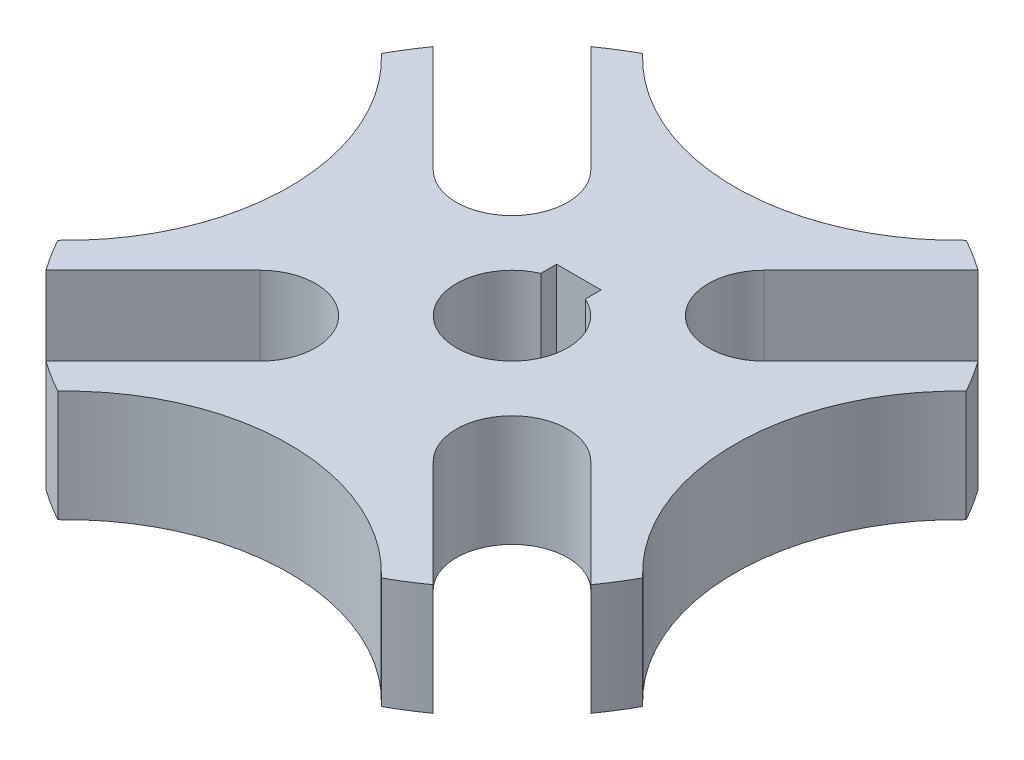
ISO-10303-21;
HEADER;
FILE_DESCRIPTION(('STEP AP214'),'2;1');
FILE_NAME('part.step','',(''),(''),'','','');
FILE_SCHEMA(('AUTOMOTIVE_DESIGN { 1 0 10303 214 1 1 1 1 }'));
ENDSEC;
DATA;
#1=APPLICATION_CONTEXT('core data for automotive mechanical design processes');
#2=APPLICATION_PROTOCOL_DEFINITION('international standard','automotive_design',2000,#1);
#3=PRODUCT_CONTEXT('',#1,'mechanical');
#4=PRODUCT('Part','Part','',(#3));
#5=PRODUCT_RELATED_PRODUCT_CATEGORY('part','',(#4));
#6=PRODUCT_DEFINITION_FORMATION('','',#4);
#7=PRODUCT_DEFINITION_CONTEXT('part definition',#1,'design');
#8=PRODUCT_DEFINITION('design','',#6,#7);
#9=PRODUCT_DEFINITION_SHAPE('','',#8);
#10=(LENGTH_UNIT() NAMED_UNIT(*) SI_UNIT(.MILLI.,.METRE.));
#11=(NAMED_UNIT(*) PLANE_ANGLE_UNIT() SI_UNIT($,.RADIAN.));
#12=(NAMED_UNIT(*) SI_UNIT($,.STERADIAN.) SOLID_ANGLE_UNIT());
#13=UNCERTAINTY_MEASURE_WITH_UNIT(LENGTH_MEASURE(1.E-05),#10,'distance_accuracy_value','');
#14=(GEOMETRIC_REPRESENTATION_CONTEXT(3) GLOBAL_UNCERTAINTY_ASSIGNED_CONTEXT((#13)) GLOBAL_UNIT_ASSIGNED_CONTEXT((#10,
#11,#12)) REPRESENTATION_CONTEXT('',''));
#15=CARTESIAN_POINT('',(0.,0.,0.));
#16=DIRECTION('',(0.,0.,1.));
#17=DIRECTION('',(1.,0.,0.));
#18=AXIS2_PLACEMENT_3D('',#15,#16,#17);
#19=CARTESIAN_POINT('',(0.,5.,0.));
#20=DIRECTION('',(0.,-1.,0.));
#21=DIRECTION('',(0.,0.,-1.));
#22=AXIS2_PLACEMENT_3D('',#19,#20,#21);
#23=CYLINDRICAL_SURFACE('',#22,15.);
#24=CARTESIAN_POINT('',(0.,5.,0.));
#25=DIRECTION('',(0.,1.,0.));
#26=DIRECTION('',(0.,0.,1.));
#27=AXIS2_PLACEMENT_3D('',#24,#25,#26);
#28=CIRCLE('',#27,15.);
#29=CARTESIAN_POINT('',(-8.69048337870963,5.,12.2260172846423));
#30=VERTEX_POINT('',#29);
#31=CARTESIAN_POINT('',(-7.26184377413899,5.,13.1249999999999));
#32=VERTEX_POINT('',#31);
#33=EDGE_CURVE('E362',#30,#32,#28,.T.);
#34=ORIENTED_EDGE('',*,*,#33,.F.);
#35=DIRECTION('',(0.,-1.,0.));
#36=VECTOR('',#35,1.);
#37=CARTESIAN_POINT('',(-8.69048337870963,5.,12.2260172846423));
#38=LINE('',#37,#36);
#39=CARTESIAN_POINT('',(-8.69048337870963,0.,12.2260172846423));
#40=VERTEX_POINT('',#39);
#41=EDGE_CURVE('E305',#30,#40,#38,.T.);
#42=ORIENTED_EDGE('',*,*,#41,.T.);
#43=CARTESIAN_POINT('',(0.,0.,0.));
#44=DIRECTION('',(0.,1.,0.));
#45=DIRECTION('',(0.,0.,1.));
#46=AXIS2_PLACEMENT_3D('',#43,#44,#45);
#47=CIRCLE('',#46,15.);
#48=CARTESIAN_POINT('',(-7.261843774139,0.,13.125));
#49=VERTEX_POINT('',#48);
#50=EDGE_CURVE('E354',#40,#49,#47,.T.);
#51=ORIENTED_EDGE('',*,*,#50,.T.);
#52=DIRECTION('',(0.,1.,0.));
#53=VECTOR('',#52,1.);
#54=CARTESIAN_POINT('',(-7.26184377413899,0.,13.125));
#55=LINE('',#54,#53);
#56=EDGE_CURVE('E397',#49,#32,#55,.T.);
#57=ORIENTED_EDGE('',*,*,#56,.T.);
#58=EDGE_LOOP('',(#34,#42,#51,#57));
#59=FACE_BOUND('',#58,.T.);
#60=ADVANCED_FACE('F39',(#59),#23,.T.);
#61=CARTESIAN_POINT('',(12.2260172846423,5.,8.69048337870959));
#62=VERTEX_POINT('',#61);
#63=CARTESIAN_POINT('',(13.125,5.,7.26184377413895));
#64=VERTEX_POINT('',#63);
#65=EDGE_CURVE('E361',#62,#64,#28,.T.);
#66=ORIENTED_EDGE('',*,*,#65,.F.);
#67=DIRECTION('',(0.,-1.,0.));
#68=VECTOR('',#67,1.);
#69=CARTESIAN_POINT('',(12.2260172846423,5.,8.69048337870959));
#70=LINE('',#69,#68);
#71=CARTESIAN_POINT('',(12.2260172846423,0.,8.69048337870959));
#72=VERTEX_POINT('',#71);
#73=EDGE_CURVE('E301',#62,#72,#70,.T.);
#74=ORIENTED_EDGE('',*,*,#73,.T.);
#75=CARTESIAN_POINT('',(13.125,0.,7.26184377413895));
#76=VERTEX_POINT('',#75);
#77=EDGE_CURVE('E367',#72,#76,#47,.T.);
#78=ORIENTED_EDGE('',*,*,#77,.T.);
#79=DIRECTION('',(0.,1.,0.));
#80=VECTOR('',#79,1.);
#81=CARTESIAN_POINT('',(13.125,0.,7.26184377413895));
#82=LINE('',#81,#80);
#83=EDGE_CURVE('E391',#76,#64,#82,.T.);
#84=ORIENTED_EDGE('',*,*,#83,.T.);
#85=EDGE_LOOP('',(#66,#74,#78,#84));
#86=FACE_BOUND('',#85,.T.);
#87=ADVANCED_FACE('F457',(#86),#23,.T.);
#88=CARTESIAN_POINT('',(-12.2260172846424,5.,-8.6904833787095));
#89=VERTEX_POINT('',#88);
#90=CARTESIAN_POINT('',(-13.1249999999999,5.,-7.26184377413904));
#91=VERTEX_POINT('',#90);
#92=EDGE_CURVE('E467',#89,#91,#28,.T.);
#93=ORIENTED_EDGE('',*,*,#92,.F.);
#94=DIRECTION('',(0.,-1.,0.));
#95=VECTOR('',#94,1.);
#96=CARTESIAN_POINT('',(-12.2260172846424,5.,-8.6904833787095));
#97=LINE('',#96,#95);
#98=CARTESIAN_POINT('',(-12.2260172846424,0.,-8.6904833787095));
#99=VERTEX_POINT('',#98);
#100=EDGE_CURVE('E295',#89,#99,#97,.T.);
#101=ORIENTED_EDGE('',*,*,#100,.T.);
#102=CARTESIAN_POINT('',(-13.1249999999999,0.,-7.26184377413904));
#103=VERTEX_POINT('',#102);
#104=EDGE_CURVE('E368',#99,#103,#47,.T.);
#105=ORIENTED_EDGE('',*,*,#104,.T.);
#106=DIRECTION('',(0.,1.,0.));
#107=VECTOR('',#106,1.);
#108=CARTESIAN_POINT('',(-13.1249999999999,0.,-7.26184377413904));
#109=LINE('',#108,#107);
#110=EDGE_CURVE('E385',#103,#91,#109,.T.);
#111=ORIENTED_EDGE('',*,*,#110,.T.);
#112=EDGE_LOOP('',(#93,#101,#105,#111));
#113=FACE_BOUND('',#112,.T.);
#114=ADVANCED_FACE('F505',(#113),#23,.T.);
#115=CARTESIAN_POINT('',(8.69048337870955,5.,-12.2260172846423));
#116=VERTEX_POINT('',#115);
#117=CARTESIAN_POINT('',(7.2618437741389,5.,-13.125));
#118=VERTEX_POINT('',#117);
#119=EDGE_CURVE('E466',#116,#118,#28,.T.);
#120=ORIENTED_EDGE('',*,*,#119,.F.);
#121=DIRECTION('',(0.,-1.,0.));
#122=VECTOR('',#121,1.);
#123=CARTESIAN_POINT('',(8.69048337870954,5.,-12.2260172846423));
#124=LINE('',#123,#122);
#125=CARTESIAN_POINT('',(8.69048337870954,0.,-12.2260172846423));
#126=VERTEX_POINT('',#125);
#127=EDGE_CURVE('E242',#116,#126,#124,.T.);
#128=ORIENTED_EDGE('',*,*,#127,.T.);
#129=CARTESIAN_POINT('',(7.26184377413891,0.,-13.125));
#130=VERTEX_POINT('',#129);
#131=EDGE_CURVE('E447',#126,#130,#47,.T.);
#132=ORIENTED_EDGE('',*,*,#131,.T.);
#133=DIRECTION('',(0.,1.,0.));
#134=VECTOR('',#133,1.);
#135=CARTESIAN_POINT('',(7.2618437741389,0.,-13.125));
#136=LINE('',#135,#134);
#137=EDGE_CURVE('E379',#130,#118,#136,.T.);
#138=ORIENTED_EDGE('',*,*,#137,.T.);
#139=EDGE_LOOP('',(#120,#128,#132,#138));
#140=FACE_BOUND('',#139,.T.);
#141=ADVANCED_FACE('F536',(#140),#23,.T.);
#142=CARTESIAN_POINT('',(-13.1250000000001,0.,7.26184377413877));
#143=VERTEX_POINT('',#142);
#144=CARTESIAN_POINT('',(-12.2260172846424,0.,8.69048337870952));
#145=VERTEX_POINT('',#144);
#146=EDGE_CURVE('E445',#143,#145,#47,.T.);
#147=ORIENTED_EDGE('',*,*,#146,.T.);
#148=DIRECTION('',(0.,-1.,0.));
#149=VECTOR('',#148,1.);
#150=CARTESIAN_POINT('',(-12.2260172846424,5.,8.69048337870952));
#151=LINE('',#150,#149);
#152=CARTESIAN_POINT('',(-12.2260172846424,5.,8.69048337870952));
#153=VERTEX_POINT('',#152);
#154=EDGE_CURVE('E62',#145,#153,#151,.F.);
#155=ORIENTED_EDGE('',*,*,#154,.T.);
#156=CARTESIAN_POINT('',(-13.1250000000001,5.,7.26184377413878));
#157=VERTEX_POINT('',#156);
#158=EDGE_CURVE('E441',#157,#153,#28,.T.);
#159=ORIENTED_EDGE('',*,*,#158,.F.);
#160=DIRECTION('',(0.,1.,0.));
#161=VECTOR('',#160,1.);
#162=CARTESIAN_POINT('',(-13.1250000000001,0.,7.26184377413878));
#163=LINE('',#162,#161);
#164=EDGE_CURVE('E382',#157,#143,#163,.F.);
#165=ORIENTED_EDGE('',*,*,#164,.T.);
#166=EDGE_LOOP('',(#147,#155,#159,#165));
#167=FACE_BOUND('',#166,.T.);
#168=ADVANCED_FACE('F444',(#167),#23,.T.);
#169=CARTESIAN_POINT('',(7.26184377413882,0.,13.125));
#170=VERTEX_POINT('',#169);
#171=CARTESIAN_POINT('',(8.69048337870957,0.,12.2260172846423));
#172=VERTEX_POINT('',#171);
#173=EDGE_CURVE('E364',#170,#172,#47,.T.);
#174=ORIENTED_EDGE('',*,*,#173,.T.);
#175=DIRECTION('',(0.,-1.,0.));
#176=VECTOR('',#175,1.);
#177=CARTESIAN_POINT('',(8.69048337870957,5.,12.2260172846423));
#178=LINE('',#177,#176);
#179=CARTESIAN_POINT('',(8.69048337870957,5.,12.2260172846423));
#180=VERTEX_POINT('',#179);
#181=EDGE_CURVE('E298',#172,#180,#178,.F.);
#182=ORIENTED_EDGE('',*,*,#181,.T.);
#183=CARTESIAN_POINT('',(7.26184377413882,5.,13.125));
#184=VERTEX_POINT('',#183);
#185=EDGE_CURVE('E357',#184,#180,#28,.T.);
#186=ORIENTED_EDGE('',*,*,#185,.F.);
#187=DIRECTION('',(0.,1.,0.));
#188=VECTOR('',#187,1.);
#189=CARTESIAN_POINT('',(7.26184377413882,0.,13.125));
#190=LINE('',#189,#188);
#191=EDGE_CURVE('E394',#184,#170,#190,.F.);
#192=ORIENTED_EDGE('',*,*,#191,.T.);
#193=EDGE_LOOP('',(#174,#182,#186,#192));
#194=FACE_BOUND('',#193,.T.);
#195=ADVANCED_FACE('F480',(#194),#23,.T.);
#196=CARTESIAN_POINT('',(-7.26184377413891,0.,-13.125));
#197=VERTEX_POINT('',#196);
#198=CARTESIAN_POINT('',(-8.69048337870965,0.,-12.2260172846423));
#199=VERTEX_POINT('',#198);
#200=EDGE_CURVE('E446',#197,#199,#47,.T.);
#201=ORIENTED_EDGE('',*,*,#200,.T.);
#202=DIRECTION('',(0.,-1.,0.));
#203=VECTOR('',#202,1.);
#204=CARTESIAN_POINT('',(-8.69048337870965,5.,-12.2260172846423));
#205=LINE('',#204,#203);
#206=CARTESIAN_POINT('',(-8.69048337870965,5.,-12.2260172846423));
#207=VERTEX_POINT('',#206);
#208=EDGE_CURVE('E54',#199,#207,#205,.F.);
#209=ORIENTED_EDGE('',*,*,#208,.T.);
#210=CARTESIAN_POINT('',(-7.26184377413891,5.,-13.125));
#211=VERTEX_POINT('',#210);
#212=EDGE_CURVE('E468',#211,#207,#28,.T.);
#213=ORIENTED_EDGE('',*,*,#212,.F.);
#214=DIRECTION('',(0.,1.,0.));
#215=VECTOR('',#214,1.);
#216=CARTESIAN_POINT('',(-7.26184377413891,0.,-13.125));
#217=LINE('',#216,#215);
#218=EDGE_CURVE('E376',#211,#197,#217,.F.);
#219=ORIENTED_EDGE('',*,*,#218,.T.);
#220=EDGE_LOOP('',(#201,#209,#213,#219));
#221=FACE_BOUND('',#220,.T.);
#222=ADVANCED_FACE('F508',(#221),#23,.T.);
#223=CARTESIAN_POINT('',(0.,5.,0.));
#224=DIRECTION('',(0.,1.,0.));
#225=DIRECTION('',(0.,0.,1.));
#226=AXIS2_PLACEMENT_3D('',#223,#224,#225);
#227=PLANE('',#226);
#228=DIRECTION('',(0.707106781186554,0.,-0.707106781186541));
#229=VECTOR('',#228,1.);
#230=CARTESIAN_POINT('',(-9.10439808349534,5.,12.639931989428));
#231=LINE('',#230,#229);
#232=CARTESIAN_POINT('',(-3.88908729652603,5.,7.42462120245877));
#233=VERTEX_POINT('',#232);
#234=EDGE_CURVE('E272',#30,#233,#231,.T.);
#235=ORIENTED_EDGE('',*,*,#234,.F.);
#236=ORIENTED_EDGE('',*,*,#33,.T.);
#237=CARTESIAN_POINT('',(-1.32923696158415E-13,5.,20.));
#238=DIRECTION('',(0.,1.,0.));
#239=DIRECTION('',(0.,0.,1.));
#240=AXIS2_PLACEMENT_3D('',#237,#238,#239);
#241=CIRCLE('',#240,10.);
#242=EDGE_CURVE('E311',#184,#32,#241,.T.);
#243=ORIENTED_EDGE('',*,*,#242,.F.);
#244=ORIENTED_EDGE('',*,*,#185,.T.);
#245=DIRECTION('',(0.707106781186543,0.,0.707106781186552));
#246=VECTOR('',#245,1.);
#247=CARTESIAN_POINT('',(9.10439808349525,5.,12.639931989428));
#248=LINE('',#247,#246);
#249=CARTESIAN_POINT('',(3.88908729652602,5.,7.42462120245871));
#250=VERTEX_POINT('',#249);
#251=EDGE_CURVE('E266',#250,#180,#248,.T.);
#252=ORIENTED_EDGE('',*,*,#251,.F.);
#253=CARTESIAN_POINT('',(5.65685424949231,5.,5.65685424949245));
#254=DIRECTION('',(0.,1.,0.));
#255=DIRECTION('',(0.,0.,1.));
#256=AXIS2_PLACEMENT_3D('',#253,#254,#255);
#257=CIRCLE('',#256,2.5);
#258=CARTESIAN_POINT('',(7.42462120245878,5.,3.889087296526));
#259=VERTEX_POINT('',#258);
#260=EDGE_CURVE('E236',#259,#250,#257,.T.);
#261=ORIENTED_EDGE('',*,*,#260,.F.);
#262=DIRECTION('',(-0.707106781186543,0.,-0.707106781186552));
#263=VECTOR('',#262,1.);
#264=CARTESIAN_POINT('',(12.639931989428,5.,9.1043980834953));
#265=LINE('',#264,#263);
#266=EDGE_CURVE('E260',#62,#259,#265,.T.);
#267=ORIENTED_EDGE('',*,*,#266,.F.);
#268=ORIENTED_EDGE('',*,*,#65,.T.);
#269=CARTESIAN_POINT('',(20.,5.,0.));
#270=DIRECTION('',(0.,1.,0.));
#271=DIRECTION('',(0.,0.,1.));
#272=AXIS2_PLACEMENT_3D('',#269,#270,#271);
#273=CIRCLE('',#272,10.);
#274=CARTESIAN_POINT('',(13.125,5.,-7.26184377413886));
#275=VERTEX_POINT('',#274);
#276=EDGE_CURVE('E314',#275,#64,#273,.T.);
#277=ORIENTED_EDGE('',*,*,#276,.F.);
#278=CARTESIAN_POINT('',(12.2260172846423,5.,-8.69048337870961));
#279=VERTEX_POINT('',#278);
#280=EDGE_CURVE('E363',#275,#279,#28,.T.);
#281=ORIENTED_EDGE('',*,*,#280,.T.);
#282=DIRECTION('',(0.70710678118655,0.,-0.707106781186546));
#283=VECTOR('',#282,1.);
#284=CARTESIAN_POINT('',(12.639931989428,5.,-9.1043980834953));
#285=LINE('',#284,#283);
#286=CARTESIAN_POINT('',(7.4246212024587,5.,-3.88908729652605));
#287=VERTEX_POINT('',#286);
#288=EDGE_CURVE('E245',#287,#279,#285,.T.);
#289=ORIENTED_EDGE('',*,*,#288,.F.);
#290=CARTESIAN_POINT('',(5.65685424949242,5.,-5.65685424949233));
#291=DIRECTION('',(0.,1.,0.));
#292=DIRECTION('',(0.,0.,1.));
#293=AXIS2_PLACEMENT_3D('',#290,#291,#292);
#294=CIRCLE('',#293,2.5);
#295=CARTESIAN_POINT('',(3.88908729652598,5.,-7.42462120245879));
#296=VERTEX_POINT('',#295);
#297=EDGE_CURVE('E229',#296,#287,#294,.T.);
#298=ORIENTED_EDGE('',*,*,#297,.F.);
#299=DIRECTION('',(-0.70710678118655,0.,0.707106781186546));
#300=VECTOR('',#299,1.);
#301=CARTESIAN_POINT('',(9.10439808349525,5.,-12.639931989428));
#302=LINE('',#301,#300);
#303=EDGE_CURVE('E239',#116,#296,#302,.T.);
#304=ORIENTED_EDGE('',*,*,#303,.F.);
#305=ORIENTED_EDGE('',*,*,#119,.T.);
#306=CARTESIAN_POINT('',(0.,5.,-20.));
#307=DIRECTION('',(0.,1.,0.));
#308=DIRECTION('',(0.,0.,1.));
#309=AXIS2_PLACEMENT_3D('',#306,#307,#308);
#310=CIRCLE('',#309,10.);
#311=EDGE_CURVE('E317',#211,#118,#310,.T.);
#312=ORIENTED_EDGE('',*,*,#311,.F.);
#313=ORIENTED_EDGE('',*,*,#212,.T.);
#314=DIRECTION('',(-0.707106781186548,0.,-0.707106781186547));
#315=VECTOR('',#314,1.);
#316=CARTESIAN_POINT('',(-9.10439808349534,5.,-12.6399319894279));
#317=LINE('',#316,#315);
#318=CARTESIAN_POINT('',(-3.88908729652607,5.,-7.42462120245869));
#319=VERTEX_POINT('',#318);
#320=EDGE_CURVE('E254',#319,#207,#317,.T.);
#321=ORIENTED_EDGE('',*,*,#320,.F.);
#322=CARTESIAN_POINT('',(-5.65685424949235,5.,-5.65685424949241));
#323=DIRECTION('',(0.,1.,0.));
#324=DIRECTION('',(0.,0.,1.));
#325=AXIS2_PLACEMENT_3D('',#322,#323,#324);
#326=CIRCLE('',#325,2.5);
#327=CARTESIAN_POINT('',(-7.42462120245881,5.,-3.88908729652595));
#328=VERTEX_POINT('',#327);
#329=EDGE_CURVE('E251',#328,#319,#326,.T.);
#330=ORIENTED_EDGE('',*,*,#329,.F.);
#331=DIRECTION('',(0.707106781186548,0.,0.707106781186547));
#332=VECTOR('',#331,1.);
#333=CARTESIAN_POINT('',(-12.6399319894281,5.,-9.10439808349521));
#334=LINE('',#333,#332);
#335=EDGE_CURVE('E282',#89,#328,#334,.T.);
#336=ORIENTED_EDGE('',*,*,#335,.F.);
#337=ORIENTED_EDGE('',*,*,#92,.T.);
#338=CARTESIAN_POINT('',(-20.,5.,-2.02753322935278E-13));
#339=DIRECTION('',(0.,1.,0.));
#340=DIRECTION('',(0.,0.,1.));
#341=AXIS2_PLACEMENT_3D('',#338,#339,#340);
#342=CIRCLE('',#341,10.);
#343=EDGE_CURVE('E308',#157,#91,#342,.T.);
#344=ORIENTED_EDGE('',*,*,#343,.F.);
#345=ORIENTED_EDGE('',*,*,#158,.T.);
#346=DIRECTION('',(-0.707106781186555,0.,0.707106781186541));
#347=VECTOR('',#346,1.);
#348=CARTESIAN_POINT('',(-12.639931989428,5.,9.10439808349521));
#349=LINE('',#348,#347);
#350=CARTESIAN_POINT('',(-7.42462120245873,5.,3.889087296526));
#351=VERTEX_POINT('',#350);
#352=EDGE_CURVE('E277',#351,#153,#349,.T.);
#353=ORIENTED_EDGE('',*,*,#352,.F.);
#354=CARTESIAN_POINT('',(-5.65685424949246,5.,5.6568542494923));
#355=DIRECTION('',(0.,1.,0.));
#356=DIRECTION('',(0.,0.,1.));
#357=AXIS2_PLACEMENT_3D('',#354,#355,#356);
#358=CIRCLE('',#357,2.5);
#359=EDGE_CURVE('E263',#233,#351,#358,.T.);
#360=ORIENTED_EDGE('',*,*,#359,.F.);
#361=EDGE_LOOP('',(#235,#236,#243,#244,#252,#261,#267,#268,#277,#281,#289,#298,#304,#305,#312,
#313,#321,#330,#336,#337,#344,#345,#353,#360));
#362=FACE_BOUND('',#361,.T.);
#363=DIRECTION('',(0.,0.,-1.));
#364=VECTOR('',#363,1.);
#365=CARTESIAN_POINT('',(1.,5.,-3.));
#366=LINE('',#365,#364);
#367=CARTESIAN_POINT('',(1.,5.,-2.29128784747792));
#368=VERTEX_POINT('',#367);
#369=CARTESIAN_POINT('',(1.,5.,-3.));
#370=VERTEX_POINT('',#369);
#371=EDGE_CURVE('E332',#368,#370,#366,.T.);
#372=ORIENTED_EDGE('',*,*,#371,.F.);
#373=CARTESIAN_POINT('',(0.,5.,0.));
#374=DIRECTION('',(0.,1.,0.));
#375=DIRECTION('',(0.,0.,1.));
#376=AXIS2_PLACEMENT_3D('',#373,#374,#375);
#377=CIRCLE('',#376,2.5);
#378=CARTESIAN_POINT('',(-1.,5.,-2.29128784747792));
#379=VERTEX_POINT('',#378);
#380=EDGE_CURVE('E351',#379,#368,#377,.T.);
#381=ORIENTED_EDGE('',*,*,#380,.F.);
#382=DIRECTION('',(0.,0.,1.));
#383=VECTOR('',#382,1.);
#384=CARTESIAN_POINT('',(-1.,5.,-3.));
#385=LINE('',#384,#383);
#386=CARTESIAN_POINT('',(-1.,5.,-3.));
#387=VERTEX_POINT('',#386);
#388=EDGE_CURVE('E338',#387,#379,#385,.T.);
#389=ORIENTED_EDGE('',*,*,#388,.F.);
#390=DIRECTION('',(-1.,0.,0.));
#391=VECTOR('',#390,1.);
#392=CARTESIAN_POINT('',(-1.,5.,-3.));
#393=LINE('',#392,#391);
#394=EDGE_CURVE('E335',#370,#387,#393,.T.);
#395=ORIENTED_EDGE('',*,*,#394,.F.);
#396=EDGE_LOOP('',(#372,#381,#389,#395));
#397=FACE_BOUND('',#396,.T.);
#398=ADVANCED_FACE('F248',(#362,#397),#227,.T.);
#399=CARTESIAN_POINT('',(0.,0.,0.));
#400=DIRECTION('',(0.,1.,0.));
#401=DIRECTION('',(0.,0.,1.));
#402=AXIS2_PLACEMENT_3D('',#399,#400,#401);
#403=PLANE('',#402);
#404=CARTESIAN_POINT('',(0.,0.,0.));
#405=DIRECTION('',(0.,1.,0.));
#406=DIRECTION('',(0.,0.,1.));
#407=AXIS2_PLACEMENT_3D('',#404,#405,#406);
#408=CIRCLE('',#407,2.5);
#409=CARTESIAN_POINT('',(-1.,0.,-2.29128784747792));
#410=VERTEX_POINT('',#409);
#411=CARTESIAN_POINT('',(1.,0.,-2.29128784747792));
#412=VERTEX_POINT('',#411);
#413=EDGE_CURVE('E350',#410,#412,#408,.T.);
#414=ORIENTED_EDGE('',*,*,#413,.T.);
#415=DIRECTION('',(0.,0.,-1.));
#416=VECTOR('',#415,1.);
#417=CARTESIAN_POINT('',(1.,0.,0.));
#418=LINE('',#417,#416);
#419=CARTESIAN_POINT('',(1.,0.,-3.));
#420=VERTEX_POINT('',#419);
#421=EDGE_CURVE('E347',#412,#420,#418,.T.);
#422=ORIENTED_EDGE('',*,*,#421,.T.);
#423=DIRECTION('',(-1.,0.,0.));
#424=VECTOR('',#423,1.);
#425=CARTESIAN_POINT('',(0.,0.,-3.));
#426=LINE('',#425,#424);
#427=CARTESIAN_POINT('',(-1.,0.,-3.));
#428=VERTEX_POINT('',#427);
#429=EDGE_CURVE('E373',#420,#428,#426,.T.);
#430=ORIENTED_EDGE('',*,*,#429,.T.);
#431=DIRECTION('',(0.,0.,1.));
#432=VECTOR('',#431,1.);
#433=CARTESIAN_POINT('',(-1.,0.,0.));
#434=LINE('',#433,#432);
#435=EDGE_CURVE('E343',#428,#410,#434,.T.);
#436=ORIENTED_EDGE('',*,*,#435,.T.);
#437=EDGE_LOOP('',(#414,#422,#430,#436));
#438=FACE_BOUND('',#437,.T.);
#439=ORIENTED_EDGE('',*,*,#50,.F.);
#440=DIRECTION('',(0.707106781186554,0.,-0.707106781186541));
#441=VECTOR('',#440,1.);
#442=CARTESIAN_POINT('',(1.76776695296641,0.,1.76776695296644));
#443=LINE('',#442,#441);
#444=CARTESIAN_POINT('',(-3.88908729652603,0.,7.42462120245877));
#445=VERTEX_POINT('',#444);
#446=EDGE_CURVE('E11',#40,#445,#443,.T.);
#447=ORIENTED_EDGE('',*,*,#446,.T.);
#448=CARTESIAN_POINT('',(-5.65685424949246,0.,5.6568542494923));
#449=DIRECTION('',(0.,1.,0.));
#450=DIRECTION('',(0.,0.,1.));
#451=AXIS2_PLACEMENT_3D('',#448,#449,#450);
#452=CIRCLE('',#451,2.5);
#453=CARTESIAN_POINT('',(-7.42462120245873,0.,3.889087296526));
#454=VERTEX_POINT('',#453);
#455=EDGE_CURVE('E47',#445,#454,#452,.T.);
#456=ORIENTED_EDGE('',*,*,#455,.T.);
#457=DIRECTION('',(-0.707106781186555,0.,0.707106781186541));
#458=VECTOR('',#457,1.);
#459=CARTESIAN_POINT('',(-1.76776695296629,0.,-1.76776695296633));
#460=LINE('',#459,#458);
#461=EDGE_CURVE('E422',#454,#145,#460,.T.);
#462=ORIENTED_EDGE('',*,*,#461,.T.);
#463=ORIENTED_EDGE('',*,*,#146,.F.);
#464=CARTESIAN_POINT('',(-20.,0.,-2.02753322935278E-13));
#465=DIRECTION('',(0.,1.,0.));
#466=DIRECTION('',(0.,0.,1.));
#467=AXIS2_PLACEMENT_3D('',#464,#465,#466);
#468=CIRCLE('',#467,10.);
#469=EDGE_CURVE('E323',#143,#103,#468,.T.);
#470=ORIENTED_EDGE('',*,*,#469,.T.);
#471=ORIENTED_EDGE('',*,*,#104,.F.);
#472=DIRECTION('',(0.707106781186548,0.,0.707106781186547));
#473=VECTOR('',#472,1.);
#474=CARTESIAN_POINT('',(-1.76776695296642,0.,1.76776695296643));
#475=LINE('',#474,#473);
#476=CARTESIAN_POINT('',(-7.42462120245881,0.,-3.88908729652595));
#477=VERTEX_POINT('',#476);
#478=EDGE_CURVE('E409',#99,#477,#475,.T.);
#479=ORIENTED_EDGE('',*,*,#478,.T.);
#480=CARTESIAN_POINT('',(-5.65685424949235,0.,-5.65685424949241));
#481=DIRECTION('',(0.,1.,0.));
#482=DIRECTION('',(0.,0.,1.));
#483=AXIS2_PLACEMENT_3D('',#480,#481,#482);
#484=CIRCLE('',#483,2.5);
#485=CARTESIAN_POINT('',(-3.88908729652607,0.,-7.42462120245869));
#486=VERTEX_POINT('',#485);
#487=EDGE_CURVE('E406',#477,#486,#484,.T.);
#488=ORIENTED_EDGE('',*,*,#487,.T.);
#489=DIRECTION('',(-0.707106781186548,0.,-0.707106781186547));
#490=VECTOR('',#489,1.);
#491=CARTESIAN_POINT('',(1.76776695296631,0.,-1.76776695296631));
#492=LINE('',#491,#490);
#493=EDGE_CURVE('E404',#486,#199,#492,.T.);
#494=ORIENTED_EDGE('',*,*,#493,.T.);
#495=ORIENTED_EDGE('',*,*,#200,.F.);
#496=CARTESIAN_POINT('',(0.,0.,-20.));
#497=DIRECTION('',(0.,1.,0.));
#498=DIRECTION('',(0.,0.,1.));
#499=AXIS2_PLACEMENT_3D('',#496,#497,#498);
#500=CIRCLE('',#499,10.);
#501=EDGE_CURVE('E320',#197,#130,#500,.T.);
#502=ORIENTED_EDGE('',*,*,#501,.T.);
#503=ORIENTED_EDGE('',*,*,#131,.F.);
#504=DIRECTION('',(-0.70710678118655,0.,0.707106781186546));
#505=VECTOR('',#504,1.);
#506=CARTESIAN_POINT('',(-1.76776695296642,0.,-1.76776695296643));
#507=LINE('',#506,#505);
#508=CARTESIAN_POINT('',(3.88908729652598,0.,-7.42462120245879));
#509=VERTEX_POINT('',#508);
#510=EDGE_CURVE('E292',#126,#509,#507,.T.);
#511=ORIENTED_EDGE('',*,*,#510,.T.);
#512=CARTESIAN_POINT('',(5.65685424949242,0.,-5.65685424949233));
#513=DIRECTION('',(0.,1.,0.));
#514=DIRECTION('',(0.,0.,1.));
#515=AXIS2_PLACEMENT_3D('',#512,#513,#514);
#516=CIRCLE('',#515,2.5);
#517=CARTESIAN_POINT('',(7.4246212024587,0.,-3.88908729652605));
#518=VERTEX_POINT('',#517);
#519=EDGE_CURVE('E232',#509,#518,#516,.T.);
#520=ORIENTED_EDGE('',*,*,#519,.T.);
#521=DIRECTION('',(0.70710678118655,0.,-0.707106781186546));
#522=VECTOR('',#521,1.);
#523=CARTESIAN_POINT('',(1.76776695296631,0.,1.76776695296632));
#524=LINE('',#523,#522);
#525=CARTESIAN_POINT('',(12.2260172846423,0.,-8.69048337870961));
#526=VERTEX_POINT('',#525);
#527=EDGE_CURVE('E288',#518,#526,#524,.T.);
#528=ORIENTED_EDGE('',*,*,#527,.T.);
#529=CARTESIAN_POINT('',(13.125,0.,-7.26184377413886));
#530=VERTEX_POINT('',#529);
#531=EDGE_CURVE('E369',#530,#526,#47,.T.);
#532=ORIENTED_EDGE('',*,*,#531,.F.);
#533=CARTESIAN_POINT('',(20.,0.,0.));
#534=DIRECTION('',(0.,1.,0.));
#535=DIRECTION('',(0.,0.,1.));
#536=AXIS2_PLACEMENT_3D('',#533,#534,#535);
#537=CIRCLE('',#536,10.);
#538=EDGE_CURVE('E326',#530,#76,#537,.T.);
#539=ORIENTED_EDGE('',*,*,#538,.T.);
#540=ORIENTED_EDGE('',*,*,#77,.F.);
#541=DIRECTION('',(-0.707106781186543,0.,-0.707106781186552));
#542=VECTOR('',#541,1.);
#543=CARTESIAN_POINT('',(1.76776695296644,0.,-1.76776695296641));
#544=LINE('',#543,#542);
#545=CARTESIAN_POINT('',(7.42462120245878,0.,3.889087296526));
#546=VERTEX_POINT('',#545);
#547=EDGE_CURVE('E419',#72,#546,#544,.T.);
#548=ORIENTED_EDGE('',*,*,#547,.T.);
#549=CARTESIAN_POINT('',(5.65685424949231,0.,5.65685424949245));
#550=DIRECTION('',(0.,1.,0.));
#551=DIRECTION('',(0.,0.,1.));
#552=AXIS2_PLACEMENT_3D('',#549,#550,#551);
#553=CIRCLE('',#552,2.5);
#554=CARTESIAN_POINT('',(3.88908729652602,0.,7.42462120245871));
#555=VERTEX_POINT('',#554);
#556=EDGE_CURVE('E416',#546,#555,#553,.T.);
#557=ORIENTED_EDGE('',*,*,#556,.T.);
#558=DIRECTION('',(0.707106781186543,0.,0.707106781186552));
#559=VECTOR('',#558,1.);
#560=CARTESIAN_POINT('',(-1.76776695296632,0.,1.7677669529663));
#561=LINE('',#560,#559);
#562=EDGE_CURVE('E413',#555,#172,#561,.T.);
#563=ORIENTED_EDGE('',*,*,#562,.T.);
#564=ORIENTED_EDGE('',*,*,#173,.F.);
#565=CARTESIAN_POINT('',(-1.32923696158415E-13,0.,20.));
#566=DIRECTION('',(0.,1.,0.));
#567=DIRECTION('',(0.,0.,1.));
#568=AXIS2_PLACEMENT_3D('',#565,#566,#567);
#569=CIRCLE('',#568,10.);
#570=EDGE_CURVE('E329',#170,#49,#569,.T.);
#571=ORIENTED_EDGE('',*,*,#570,.T.);
#572=EDGE_LOOP('',(#439,#447,#456,#462,#463,#470,#471,#479,#488,#494,#495,#502,#503,#511,#520,
#528,#532,#539,#540,#548,#557,#563,#564,#571));
#573=FACE_BOUND('',#572,.T.);
#574=ADVANCED_FACE('F426',(#438,#573),#403,.F.);
#575=ORIENTED_EDGE('',*,*,#531,.T.);
#576=DIRECTION('',(0.,-1.,0.));
#577=VECTOR('',#576,1.);
#578=CARTESIAN_POINT('',(12.2260172846423,5.,-8.69048337870961));
#579=LINE('',#578,#577);
#580=EDGE_CURVE('E400',#526,#279,#579,.F.);
#581=ORIENTED_EDGE('',*,*,#580,.T.);
#582=ORIENTED_EDGE('',*,*,#280,.F.);
#583=DIRECTION('',(0.,1.,0.));
#584=VECTOR('',#583,1.);
#585=CARTESIAN_POINT('',(13.125,0.,-7.26184377413887));
#586=LINE('',#585,#584);
#587=EDGE_CURVE('E388',#275,#530,#586,.F.);
#588=ORIENTED_EDGE('',*,*,#587,.T.);
#589=EDGE_LOOP('',(#575,#581,#582,#588));
#590=FACE_BOUND('',#589,.T.);
#591=ADVANCED_FACE('F41',(#590),#23,.T.);
#592=CARTESIAN_POINT('',(0.,5.,0.));
#593=DIRECTION('',(0.,-1.,0.));
#594=DIRECTION('',(0.,0.,-1.));
#595=AXIS2_PLACEMENT_3D('',#592,#593,#594);
#596=CYLINDRICAL_SURFACE('',#595,2.5);
#597=DIRECTION('',(0.,-1.,0.));
#598=VECTOR('',#597,1.);
#599=CARTESIAN_POINT('',(1.,5.,-2.29128784747792));
#600=LINE('',#599,#598);
#601=EDGE_CURVE('E371',#412,#368,#600,.F.);
#602=ORIENTED_EDGE('',*,*,#601,.F.);
#603=ORIENTED_EDGE('',*,*,#413,.F.);
#604=DIRECTION('',(0.,-1.,0.));
#605=VECTOR('',#604,1.);
#606=CARTESIAN_POINT('',(-1.,5.,-2.29128784747792));
#607=LINE('',#606,#605);
#608=EDGE_CURVE('E360',#379,#410,#607,.T.);
#609=ORIENTED_EDGE('',*,*,#608,.F.);
#610=ORIENTED_EDGE('',*,*,#380,.T.);
#611=EDGE_LOOP('',(#602,#603,#609,#610));
#612=FACE_BOUND('',#611,.T.);
#613=ADVANCED_FACE('F507',(#612),#596,.F.);
#614=CARTESIAN_POINT('',(-1.,-5.,-3.));
#615=DIRECTION('',(0.,0.,-1.));
#616=DIRECTION('',(-1.,0.,0.));
#617=AXIS2_PLACEMENT_3D('',#614,#615,#616);
#618=PLANE('',#617);
#619=DIRECTION('',(0.,1.,0.));
#620=VECTOR('',#619,1.);
#621=CARTESIAN_POINT('',(1.,-5.,-3.));
#622=LINE('',#621,#620);
#623=EDGE_CURVE('E340',#420,#370,#622,.T.);
#624=ORIENTED_EDGE('',*,*,#623,.T.);
#625=ORIENTED_EDGE('',*,*,#394,.T.);
#626=DIRECTION('',(0.,1.,0.));
#627=VECTOR('',#626,1.);
#628=CARTESIAN_POINT('',(-1.,-5.,-3.));
#629=LINE('',#628,#627);
#630=EDGE_CURVE('E341',#428,#387,#629,.T.);
#631=ORIENTED_EDGE('',*,*,#630,.F.);
#632=ORIENTED_EDGE('',*,*,#429,.F.);
#633=EDGE_LOOP('',(#624,#625,#631,#632));
#634=FACE_BOUND('',#633,.T.);
#635=ADVANCED_FACE('F514',(#634),#618,.F.);
#636=CARTESIAN_POINT('',(1.,-5.,-3.));
#637=DIRECTION('',(1.,0.,0.));
#638=DIRECTION('',(0.,0.,-1.));
#639=AXIS2_PLACEMENT_3D('',#636,#637,#638);
#640=PLANE('',#639);
#641=ORIENTED_EDGE('',*,*,#601,.T.);
#642=ORIENTED_EDGE('',*,*,#371,.T.);
#643=ORIENTED_EDGE('',*,*,#623,.F.);
#644=ORIENTED_EDGE('',*,*,#421,.F.);
#645=EDGE_LOOP('',(#641,#642,#643,#644));
#646=FACE_BOUND('',#645,.T.);
#647=ADVANCED_FACE('F573',(#646),#640,.F.);
#648=CARTESIAN_POINT('',(-1.,-5.,-3.));
#649=DIRECTION('',(-1.,0.,0.));
#650=DIRECTION('',(0.,0.,1.));
#651=AXIS2_PLACEMENT_3D('',#648,#649,#650);
#652=PLANE('',#651);
#653=ORIENTED_EDGE('',*,*,#630,.T.);
#654=ORIENTED_EDGE('',*,*,#388,.T.);
#655=ORIENTED_EDGE('',*,*,#608,.T.);
#656=ORIENTED_EDGE('',*,*,#435,.F.);
#657=EDGE_LOOP('',(#653,#654,#655,#656));
#658=FACE_BOUND('',#657,.T.);
#659=ADVANCED_FACE('F570',(#658),#652,.F.);
#660=CARTESIAN_POINT('',(0.,-5.,-20.));
#661=DIRECTION('',(0.,1.,0.));
#662=DIRECTION('',(0.,0.,1.));
#663=AXIS2_PLACEMENT_3D('',#660,#661,#662);
#664=CYLINDRICAL_SURFACE('',#663,10.);
#665=ORIENTED_EDGE('',*,*,#501,.F.);
#666=ORIENTED_EDGE('',*,*,#218,.F.);
#667=ORIENTED_EDGE('',*,*,#311,.T.);
#668=ORIENTED_EDGE('',*,*,#137,.F.);
#669=EDGE_LOOP('',(#665,#666,#667,#668));
#670=FACE_BOUND('',#669,.T.);
#671=ADVANCED_FACE('F535',(#670),#664,.F.);
#672=CARTESIAN_POINT('',(-20.,-5.,-2.02753322935278E-13));
#673=DIRECTION('',(0.,1.,0.));
#674=DIRECTION('',(0.,0.,1.));
#675=AXIS2_PLACEMENT_3D('',#672,#673,#674);
#676=CYLINDRICAL_SURFACE('',#675,10.);
#677=ORIENTED_EDGE('',*,*,#469,.F.);
#678=ORIENTED_EDGE('',*,*,#164,.F.);
#679=ORIENTED_EDGE('',*,*,#343,.T.);
#680=ORIENTED_EDGE('',*,*,#110,.F.);
#681=EDGE_LOOP('',(#677,#678,#679,#680));
#682=FACE_BOUND('',#681,.T.);
#683=ADVANCED_FACE('F548',(#682),#676,.F.);
#684=CARTESIAN_POINT('',(20.,-5.,0.));
#685=DIRECTION('',(0.,1.,0.));
#686=DIRECTION('',(0.,0.,1.));
#687=AXIS2_PLACEMENT_3D('',#684,#685,#686);
#688=CYLINDRICAL_SURFACE('',#687,10.);
#689=ORIENTED_EDGE('',*,*,#538,.F.);
#690=ORIENTED_EDGE('',*,*,#587,.F.);
#691=ORIENTED_EDGE('',*,*,#276,.T.);
#692=ORIENTED_EDGE('',*,*,#83,.F.);
#693=EDGE_LOOP('',(#689,#690,#691,#692));
#694=FACE_BOUND('',#693,.T.);
#695=ADVANCED_FACE('F459',(#694),#688,.F.);
#696=CARTESIAN_POINT('',(-1.32923696158415E-13,-5.,20.));
#697=DIRECTION('',(0.,1.,0.));
#698=DIRECTION('',(0.,0.,1.));
#699=AXIS2_PLACEMENT_3D('',#696,#697,#698);
#700=CYLINDRICAL_SURFACE('',#699,10.);
#701=ORIENTED_EDGE('',*,*,#570,.F.);
#702=ORIENTED_EDGE('',*,*,#191,.F.);
#703=ORIENTED_EDGE('',*,*,#242,.T.);
#704=ORIENTED_EDGE('',*,*,#56,.F.);
#705=EDGE_LOOP('',(#701,#702,#703,#704));
#706=FACE_BOUND('',#705,.T.);
#707=ADVANCED_FACE('F477',(#706),#700,.F.);
#708=CARTESIAN_POINT('',(5.65685424949242,-5.,-5.65685424949233));
#709=DIRECTION('',(0.,1.,0.));
#710=DIRECTION('',(0.,0.,1.));
#711=AXIS2_PLACEMENT_3D('',#708,#709,#710);
#712=CYLINDRICAL_SURFACE('',#711,2.5);
#713=DIRECTION('',(0.,1.,0.));
#714=VECTOR('',#713,1.);
#715=CARTESIAN_POINT('',(3.88908729652598,-5.,-7.42462120245879));
#716=LINE('',#715,#714);
#717=EDGE_CURVE('E224',#509,#296,#716,.T.);
#718=ORIENTED_EDGE('',*,*,#717,.T.);
#719=ORIENTED_EDGE('',*,*,#297,.T.);
#720=DIRECTION('',(0.,1.,0.));
#721=VECTOR('',#720,1.);
#722=CARTESIAN_POINT('',(7.4246212024587,-5.,-3.88908729652605));
#723=LINE('',#722,#721);
#724=EDGE_CURVE('E235',#518,#287,#723,.T.);
#725=ORIENTED_EDGE('',*,*,#724,.F.);
#726=ORIENTED_EDGE('',*,*,#519,.F.);
#727=EDGE_LOOP('',(#718,#719,#725,#726));
#728=FACE_BOUND('',#727,.T.);
#729=ADVANCED_FACE('F226',(#728),#712,.F.);
#730=CARTESIAN_POINT('',(9.10439808349525,-5.,-12.639931989428));
#731=DIRECTION('',(-0.707106781186546,0.,-0.70710678118655));
#732=DIRECTION('',(-0.70710678118655,0.,0.707106781186546));
#733=AXIS2_PLACEMENT_3D('',#730,#731,#732);
#734=PLANE('',#733);
#735=ORIENTED_EDGE('',*,*,#127,.F.);
#736=ORIENTED_EDGE('',*,*,#303,.T.);
#737=ORIENTED_EDGE('',*,*,#717,.F.);
#738=ORIENTED_EDGE('',*,*,#510,.F.);
#739=EDGE_LOOP('',(#735,#736,#737,#738));
#740=FACE_BOUND('',#739,.T.);
#741=ADVANCED_FACE('F240',(#740),#734,.F.);
#742=CARTESIAN_POINT('',(12.639931989428,-5.,-9.1043980834953));
#743=DIRECTION('',(0.707106781186546,0.,0.70710678118655));
#744=DIRECTION('',(0.70710678118655,0.,-0.707106781186546));
#745=AXIS2_PLACEMENT_3D('',#742,#743,#744);
#746=PLANE('',#745);
#747=ORIENTED_EDGE('',*,*,#724,.T.);
#748=ORIENTED_EDGE('',*,*,#288,.T.);
#749=ORIENTED_EDGE('',*,*,#580,.F.);
#750=ORIENTED_EDGE('',*,*,#527,.F.);
#751=EDGE_LOOP('',(#747,#748,#749,#750));
#752=FACE_BOUND('',#751,.T.);
#753=ADVANCED_FACE('F558',(#752),#746,.F.);
#754=CARTESIAN_POINT('',(-5.65685424949235,-5.,-5.65685424949241));
#755=DIRECTION('',(0.,1.,0.));
#756=DIRECTION('',(0.,0.,1.));
#757=AXIS2_PLACEMENT_3D('',#754,#755,#756);
#758=CYLINDRICAL_SURFACE('',#757,2.5);
#759=DIRECTION('',(0.,1.,0.));
#760=VECTOR('',#759,1.);
#761=CARTESIAN_POINT('',(-7.42462120245881,-5.,-3.88908729652595));
#762=LINE('',#761,#760);
#763=EDGE_CURVE('E286',#477,#328,#762,.T.);
#764=ORIENTED_EDGE('',*,*,#763,.T.);
#765=ORIENTED_EDGE('',*,*,#329,.T.);
#766=DIRECTION('',(0.,1.,0.));
#767=VECTOR('',#766,1.);
#768=CARTESIAN_POINT('',(-3.88908729652607,-5.,-7.42462120245869));
#769=LINE('',#768,#767);
#770=EDGE_CURVE('E285',#486,#319,#769,.T.);
#771=ORIENTED_EDGE('',*,*,#770,.F.);
#772=ORIENTED_EDGE('',*,*,#487,.F.);
#773=EDGE_LOOP('',(#764,#765,#771,#772));
#774=FACE_BOUND('',#773,.T.);
#775=ADVANCED_FACE('F529',(#774),#758,.F.);
#776=CARTESIAN_POINT('',(-12.6399319894281,-5.,-9.10439808349521));
#777=DIRECTION('',(-0.707106781186547,0.,0.707106781186548));
#778=DIRECTION('',(0.707106781186548,0.,0.707106781186547));
#779=AXIS2_PLACEMENT_3D('',#776,#777,#778);
#780=PLANE('',#779);
#781=ORIENTED_EDGE('',*,*,#335,.T.);
#782=ORIENTED_EDGE('',*,*,#763,.F.);
#783=ORIENTED_EDGE('',*,*,#478,.F.);
#784=ORIENTED_EDGE('',*,*,#100,.F.);
#785=EDGE_LOOP('',(#781,#782,#783,#784));
#786=FACE_BOUND('',#785,.T.);
#787=ADVANCED_FACE('F550',(#786),#780,.F.);
#788=CARTESIAN_POINT('',(-9.10439808349534,-5.,-12.6399319894279));
#789=DIRECTION('',(0.707106781186547,0.,-0.707106781186548));
#790=DIRECTION('',(-0.707106781186548,0.,-0.707106781186547));
#791=AXIS2_PLACEMENT_3D('',#788,#789,#790);
#792=PLANE('',#791);
#793=ORIENTED_EDGE('',*,*,#493,.F.);
#794=ORIENTED_EDGE('',*,*,#770,.T.);
#795=ORIENTED_EDGE('',*,*,#320,.T.);
#796=ORIENTED_EDGE('',*,*,#208,.F.);
#797=EDGE_LOOP('',(#793,#794,#795,#796));
#798=FACE_BOUND('',#797,.T.);
#799=ADVANCED_FACE('F497',(#798),#792,.F.);
#800=CARTESIAN_POINT('',(5.65685424949231,-5.,5.65685424949245));
#801=DIRECTION('',(0.,1.,0.));
#802=DIRECTION('',(0.,0.,1.));
#803=AXIS2_PLACEMENT_3D('',#800,#801,#802);
#804=CYLINDRICAL_SURFACE('',#803,2.5);
#805=DIRECTION('',(0.,1.,0.));
#806=VECTOR('',#805,1.);
#807=CARTESIAN_POINT('',(7.42462120245878,-5.,3.889087296526));
#808=LINE('',#807,#806);
#809=EDGE_CURVE('E261',#546,#259,#808,.T.);
#810=ORIENTED_EDGE('',*,*,#809,.T.);
#811=ORIENTED_EDGE('',*,*,#260,.T.);
#812=DIRECTION('',(0.,1.,0.));
#813=VECTOR('',#812,1.);
#814=CARTESIAN_POINT('',(3.88908729652602,-5.,7.42462120245871));
#815=LINE('',#814,#813);
#816=EDGE_CURVE('E258',#555,#250,#815,.T.);
#817=ORIENTED_EDGE('',*,*,#816,.F.);
#818=ORIENTED_EDGE('',*,*,#556,.F.);
#819=EDGE_LOOP('',(#810,#811,#817,#818));
#820=FACE_BOUND('',#819,.T.);
#821=ADVANCED_FACE('F486',(#820),#804,.F.);
#822=CARTESIAN_POINT('',(12.639931989428,-5.,9.1043980834953));
#823=DIRECTION('',(0.707106781186552,0.,-0.707106781186543));
#824=DIRECTION('',(-0.707106781186543,0.,-0.707106781186552));
#825=AXIS2_PLACEMENT_3D('',#822,#823,#824);
#826=PLANE('',#825);
#827=ORIENTED_EDGE('',*,*,#266,.T.);
#828=ORIENTED_EDGE('',*,*,#809,.F.);
#829=ORIENTED_EDGE('',*,*,#547,.F.);
#830=ORIENTED_EDGE('',*,*,#73,.F.);
#831=EDGE_LOOP('',(#827,#828,#829,#830));
#832=FACE_BOUND('',#831,.T.);
#833=ADVANCED_FACE('F489',(#832),#826,.F.);
#834=CARTESIAN_POINT('',(9.10439808349525,-5.,12.639931989428));
#835=DIRECTION('',(-0.707106781186552,0.,0.707106781186543));
#836=DIRECTION('',(0.707106781186543,0.,0.707106781186552));
#837=AXIS2_PLACEMENT_3D('',#834,#835,#836);
#838=PLANE('',#837);
#839=ORIENTED_EDGE('',*,*,#562,.F.);
#840=ORIENTED_EDGE('',*,*,#816,.T.);
#841=ORIENTED_EDGE('',*,*,#251,.T.);
#842=ORIENTED_EDGE('',*,*,#181,.F.);
#843=EDGE_LOOP('',(#839,#840,#841,#842));
#844=FACE_BOUND('',#843,.T.);
#845=ADVANCED_FACE('F483',(#844),#838,.F.);
#846=CARTESIAN_POINT('',(-5.65685424949246,-5.,5.6568542494923));
#847=DIRECTION('',(0.,1.,0.));
#848=DIRECTION('',(0.,0.,1.));
#849=AXIS2_PLACEMENT_3D('',#846,#847,#848);
#850=CYLINDRICAL_SURFACE('',#849,2.5);
#851=DIRECTION('',(0.,1.,0.));
#852=VECTOR('',#851,1.);
#853=CARTESIAN_POINT('',(-3.88908729652603,-5.,7.42462120245877));
#854=LINE('',#853,#852);
#855=EDGE_CURVE('E273',#445,#233,#854,.T.);
#856=ORIENTED_EDGE('',*,*,#855,.T.);
#857=ORIENTED_EDGE('',*,*,#359,.T.);
#858=DIRECTION('',(0.,1.,0.));
#859=VECTOR('',#858,1.);
#860=CARTESIAN_POINT('',(-7.42462120245873,-5.,3.889087296526));
#861=LINE('',#860,#859);
#862=EDGE_CURVE('E270',#454,#351,#861,.T.);
#863=ORIENTED_EDGE('',*,*,#862,.F.);
#864=ORIENTED_EDGE('',*,*,#455,.F.);
#865=EDGE_LOOP('',(#856,#857,#863,#864));
#866=FACE_BOUND('',#865,.T.);
#867=ADVANCED_FACE('F432',(#866),#850,.F.);
#868=CARTESIAN_POINT('',(-9.10439808349534,-5.,12.639931989428));
#869=DIRECTION('',(0.707106781186541,0.,0.707106781186554));
#870=DIRECTION('',(0.707106781186554,0.,-0.707106781186541));
#871=AXIS2_PLACEMENT_3D('',#868,#869,#870);
#872=PLANE('',#871);
#873=ORIENTED_EDGE('',*,*,#234,.T.);
#874=ORIENTED_EDGE('',*,*,#855,.F.);
#875=ORIENTED_EDGE('',*,*,#446,.F.);
#876=ORIENTED_EDGE('',*,*,#41,.F.);
#877=EDGE_LOOP('',(#873,#874,#875,#876));
#878=FACE_BOUND('',#877,.T.);
#879=ADVANCED_FACE('F434',(#878),#872,.F.);
#880=CARTESIAN_POINT('',(-12.639931989428,-5.,9.10439808349521));
#881=DIRECTION('',(-0.707106781186541,0.,-0.707106781186555));
#882=DIRECTION('',(-0.707106781186555,0.,0.707106781186541));
#883=AXIS2_PLACEMENT_3D('',#880,#881,#882);
#884=PLANE('',#883);
#885=ORIENTED_EDGE('',*,*,#461,.F.);
#886=ORIENTED_EDGE('',*,*,#862,.T.);
#887=ORIENTED_EDGE('',*,*,#352,.T.);
#888=ORIENTED_EDGE('',*,*,#154,.F.);
#889=EDGE_LOOP('',(#885,#886,#887,#888));
#890=FACE_BOUND('',#889,.T.);
#891=ADVANCED_FACE('F442',(#890),#884,.F.);
#892=CLOSED_SHELL('',(#60,#87,#114,#141,#168,#195,#222,#398,#574,#591,#613,#635,#647,#659,#671,
#683,#695,#707,#729,#741,#753,#775,#787,#799,#821,#833,#845,#867,#879,#891));
#893=MANIFOLD_SOLID_BREP('B2',#892);
#894=ADVANCED_BREP_SHAPE_REPRESENTATION('',(#18,#893),#14);
#895=SHAPE_DEFINITION_REPRESENTATION(#9,#894);
ENDSEC;
END-ISO-10303-21;
